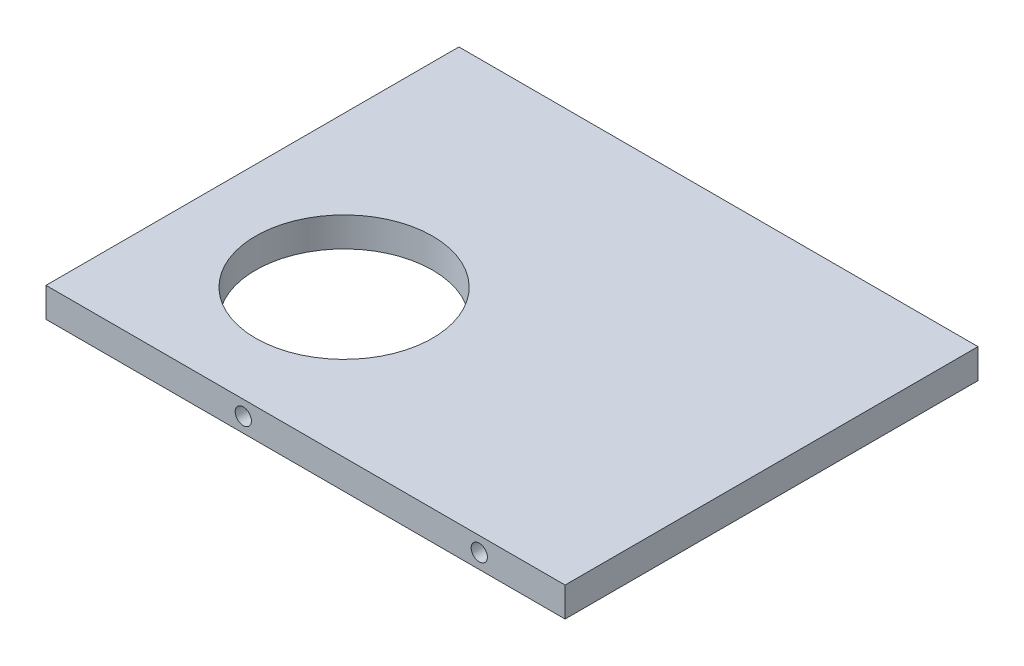
ISO-10303-21;
HEADER;
FILE_DESCRIPTION(('STEP AP214'),'2;1');
FILE_NAME('part.step','',(''),(''),'','','');
FILE_SCHEMA(('AUTOMOTIVE_DESIGN { 1 0 10303 214 1 1 1 1 }'));
ENDSEC;
DATA;
#1=APPLICATION_CONTEXT('core data for automotive mechanical design processes');
#2=APPLICATION_PROTOCOL_DEFINITION('international standard','automotive_design',2000,#1);
#3=PRODUCT_CONTEXT('',#1,'mechanical');
#4=PRODUCT('Part','Part','',(#3));
#5=PRODUCT_RELATED_PRODUCT_CATEGORY('part','',(#4));
#6=PRODUCT_DEFINITION_FORMATION('','',#4);
#7=PRODUCT_DEFINITION_CONTEXT('part definition',#1,'design');
#8=PRODUCT_DEFINITION('design','',#6,#7);
#9=PRODUCT_DEFINITION_SHAPE('','',#8);
#10=(LENGTH_UNIT() NAMED_UNIT(*) SI_UNIT(.MILLI.,.METRE.));
#11=(NAMED_UNIT(*) PLANE_ANGLE_UNIT() SI_UNIT($,.RADIAN.));
#12=(NAMED_UNIT(*) SI_UNIT($,.STERADIAN.) SOLID_ANGLE_UNIT());
#13=UNCERTAINTY_MEASURE_WITH_UNIT(LENGTH_MEASURE(1.E-05),#10,'distance_accuracy_value','');
#14=(GEOMETRIC_REPRESENTATION_CONTEXT(3) GLOBAL_UNCERTAINTY_ASSIGNED_CONTEXT((#13)) GLOBAL_UNIT_ASSIGNED_CONTEXT((#10,
#11,#12)) REPRESENTATION_CONTEXT('',''));
#15=CARTESIAN_POINT('',(0.,0.,0.));
#16=DIRECTION('',(0.,0.,1.));
#17=DIRECTION('',(1.,0.,0.));
#18=AXIS2_PLACEMENT_3D('',#15,#16,#17);
#19=CARTESIAN_POINT('',(44.,5.,-35.));
#20=DIRECTION('',(-1.,0.,0.));
#21=DIRECTION('',(0.,0.,1.));
#22=AXIS2_PLACEMENT_3D('',#19,#20,#21);
#23=PLANE('',#22);
#24=DIRECTION('',(0.,0.,-1.));
#25=VECTOR('',#24,1.);
#26=CARTESIAN_POINT('',(44.,0.,-35.));
#27=LINE('',#26,#25);
#28=CARTESIAN_POINT('',(44.,0.,35.));
#29=VERTEX_POINT('',#28);
#30=CARTESIAN_POINT('',(44.,0.,-35.));
#31=VERTEX_POINT('',#30);
#32=EDGE_CURVE('E113',#29,#31,#27,.T.);
#33=ORIENTED_EDGE('',*,*,#32,.T.);
#34=DIRECTION('',(0.,-1.,0.));
#35=VECTOR('',#34,1.);
#36=CARTESIAN_POINT('',(44.,5.,-35.));
#37=LINE('',#36,#35);
#38=CARTESIAN_POINT('',(44.,5.,-35.));
#39=VERTEX_POINT('',#38);
#40=EDGE_CURVE('E11',#39,#31,#37,.T.);
#41=ORIENTED_EDGE('',*,*,#40,.F.);
#42=DIRECTION('',(0.,0.,-1.));
#43=VECTOR('',#42,1.);
#44=CARTESIAN_POINT('',(44.,5.,-35.));
#45=LINE('',#44,#43);
#46=CARTESIAN_POINT('',(44.,5.,35.));
#47=VERTEX_POINT('',#46);
#48=EDGE_CURVE('E97',#47,#39,#45,.T.);
#49=ORIENTED_EDGE('',*,*,#48,.F.);
#50=DIRECTION('',(0.,-1.,0.));
#51=VECTOR('',#50,1.);
#52=CARTESIAN_POINT('',(44.,5.,35.));
#53=LINE('',#52,#51);
#54=EDGE_CURVE('E109',#47,#29,#53,.T.);
#55=ORIENTED_EDGE('',*,*,#54,.T.);
#56=EDGE_LOOP('',(#33,#41,#49,#55));
#57=FACE_BOUND('',#56,.T.);
#58=ADVANCED_FACE('F45',(#57),#23,.F.);
#59=CARTESIAN_POINT('',(-44.,5.,-35.));
#60=DIRECTION('',(0.,0.,1.));
#61=DIRECTION('',(1.,0.,0.));
#62=AXIS2_PLACEMENT_3D('',#59,#60,#61);
#63=PLANE('',#62);
#64=CARTESIAN_POINT('',(29.45,2.5,-35.));
#65=DIRECTION('',(0.,0.,-1.));
#66=DIRECTION('',(-1.,0.,0.));
#67=AXIS2_PLACEMENT_3D('',#64,#65,#66);
#68=CIRCLE('',#67,1.375);
#69=CARTESIAN_POINT('',(28.075,2.5,-35.));
#70=VERTEX_POINT('',#69);
#71=EDGE_CURVE('E159',#70,#70,#68,.T.);
#72=ORIENTED_EDGE('',*,*,#71,.F.);
#73=EDGE_LOOP('',(#72));
#74=FACE_BOUND('',#73,.T.);
#75=CARTESIAN_POINT('',(-10.55,2.5,-35.));
#76=DIRECTION('',(0.,0.,-1.));
#77=DIRECTION('',(-1.,0.,0.));
#78=AXIS2_PLACEMENT_3D('',#75,#76,#77);
#79=CIRCLE('',#78,1.375);
#80=CARTESIAN_POINT('',(-11.925,2.5,-35.));
#81=VERTEX_POINT('',#80);
#82=EDGE_CURVE('E154',#81,#81,#79,.T.);
#83=ORIENTED_EDGE('',*,*,#82,.F.);
#84=EDGE_LOOP('',(#83));
#85=FACE_BOUND('',#84,.T.);
#86=DIRECTION('',(-1.,0.,0.));
#87=VECTOR('',#86,1.);
#88=CARTESIAN_POINT('',(-44.,0.,-35.));
#89=LINE('',#88,#87);
#90=CARTESIAN_POINT('',(-44.,0.,-35.));
#91=VERTEX_POINT('',#90);
#92=EDGE_CURVE('E102',#31,#91,#89,.T.);
#93=ORIENTED_EDGE('',*,*,#92,.T.);
#94=DIRECTION('',(0.,-1.,0.));
#95=VECTOR('',#94,1.);
#96=CARTESIAN_POINT('',(-44.,5.,-35.));
#97=LINE('',#96,#95);
#98=CARTESIAN_POINT('',(-44.,5.,-35.));
#99=VERTEX_POINT('',#98);
#100=EDGE_CURVE('E54',#99,#91,#97,.T.);
#101=ORIENTED_EDGE('',*,*,#100,.F.);
#102=DIRECTION('',(-1.,0.,0.));
#103=VECTOR('',#102,1.);
#104=CARTESIAN_POINT('',(-44.,5.,-35.));
#105=LINE('',#104,#103);
#106=EDGE_CURVE('E92',#39,#99,#105,.T.);
#107=ORIENTED_EDGE('',*,*,#106,.F.);
#108=ORIENTED_EDGE('',*,*,#40,.T.);
#109=EDGE_LOOP('',(#93,#101,#107,#108));
#110=FACE_BOUND('',#109,.T.);
#111=ADVANCED_FACE('F101',(#74,#85,#110),#63,.F.);
#112=CARTESIAN_POINT('',(-44.,5.,-35.));
#113=DIRECTION('',(1.,0.,0.));
#114=DIRECTION('',(0.,0.,-1.));
#115=AXIS2_PLACEMENT_3D('',#112,#113,#114);
#116=PLANE('',#115);
#117=DIRECTION('',(0.,0.,1.));
#118=VECTOR('',#117,1.);
#119=CARTESIAN_POINT('',(-44.,0.,-35.));
#120=LINE('',#119,#118);
#121=CARTESIAN_POINT('',(-44.,0.,35.));
#122=VERTEX_POINT('',#121);
#123=EDGE_CURVE('E79',#91,#122,#120,.T.);
#124=ORIENTED_EDGE('',*,*,#123,.T.);
#125=DIRECTION('',(0.,-1.,0.));
#126=VECTOR('',#125,1.);
#127=CARTESIAN_POINT('',(-44.,5.,35.));
#128=LINE('',#127,#126);
#129=CARTESIAN_POINT('',(-44.,5.,35.));
#130=VERTEX_POINT('',#129);
#131=EDGE_CURVE('E104',#130,#122,#128,.T.);
#132=ORIENTED_EDGE('',*,*,#131,.F.);
#133=DIRECTION('',(0.,0.,1.));
#134=VECTOR('',#133,1.);
#135=CARTESIAN_POINT('',(-44.,5.,-35.));
#136=LINE('',#135,#134);
#137=EDGE_CURVE('E95',#99,#130,#136,.T.);
#138=ORIENTED_EDGE('',*,*,#137,.F.);
#139=ORIENTED_EDGE('',*,*,#100,.T.);
#140=EDGE_LOOP('',(#124,#132,#138,#139));
#141=FACE_BOUND('',#140,.T.);
#142=ADVANCED_FACE('F105',(#141),#116,.F.);
#143=CARTESIAN_POINT('',(-44.,5.,35.));
#144=DIRECTION('',(0.,0.,-1.));
#145=DIRECTION('',(-1.,0.,0.));
#146=AXIS2_PLACEMENT_3D('',#143,#144,#145);
#147=PLANE('',#146);
#148=CARTESIAN_POINT('',(-10.55,2.5,35.));
#149=DIRECTION('',(0.,0.,1.));
#150=DIRECTION('',(1.,0.,0.));
#151=AXIS2_PLACEMENT_3D('',#148,#149,#150);
#152=CIRCLE('',#151,1.375);
#153=CARTESIAN_POINT('',(-9.17499999999997,2.5,35.));
#154=VERTEX_POINT('',#153);
#155=EDGE_CURVE('E143',#154,#154,#152,.T.);
#156=ORIENTED_EDGE('',*,*,#155,.F.);
#157=EDGE_LOOP('',(#156));
#158=FACE_BOUND('',#157,.T.);
#159=CARTESIAN_POINT('',(29.45,2.5,35.));
#160=DIRECTION('',(0.,0.,1.));
#161=DIRECTION('',(1.,0.,0.));
#162=AXIS2_PLACEMENT_3D('',#159,#160,#161);
#163=CIRCLE('',#162,1.375);
#164=CARTESIAN_POINT('',(30.825,2.5,35.));
#165=VERTEX_POINT('',#164);
#166=EDGE_CURVE('E138',#165,#165,#163,.T.);
#167=ORIENTED_EDGE('',*,*,#166,.F.);
#168=EDGE_LOOP('',(#167));
#169=FACE_BOUND('',#168,.T.);
#170=DIRECTION('',(1.,0.,0.));
#171=VECTOR('',#170,1.);
#172=CARTESIAN_POINT('',(-44.,0.,35.));
#173=LINE('',#172,#171);
#174=EDGE_CURVE('E85',#122,#29,#173,.T.);
#175=ORIENTED_EDGE('',*,*,#174,.T.);
#176=ORIENTED_EDGE('',*,*,#54,.F.);
#177=DIRECTION('',(1.,0.,0.));
#178=VECTOR('',#177,1.);
#179=CARTESIAN_POINT('',(-44.,5.,35.));
#180=LINE('',#179,#178);
#181=EDGE_CURVE('E62',#130,#47,#180,.T.);
#182=ORIENTED_EDGE('',*,*,#181,.F.);
#183=ORIENTED_EDGE('',*,*,#131,.T.);
#184=EDGE_LOOP('',(#175,#176,#182,#183));
#185=FACE_BOUND('',#184,.T.);
#186=ADVANCED_FACE('F127',(#158,#169,#185),#147,.F.);
#187=CARTESIAN_POINT('',(0.,5.,0.));
#188=DIRECTION('',(0.,1.,0.));
#189=DIRECTION('',(0.,0.,1.));
#190=AXIS2_PLACEMENT_3D('',#187,#188,#189);
#191=PLANE('',#190);
#192=CARTESIAN_POINT('',(-18.4696577969967,5.,10.));
#193=DIRECTION('',(0.,1.,0.));
#194=DIRECTION('',(0.,0.,1.));
#195=AXIS2_PLACEMENT_3D('',#192,#193,#194);
#196=CIRCLE('',#195,15.);
#197=CARTESIAN_POINT('',(-18.4696577969967,5.,25.));
#198=VERTEX_POINT('',#197);
#199=EDGE_CURVE('E166',#198,#198,#196,.T.);
#200=ORIENTED_EDGE('',*,*,#199,.F.);
#201=EDGE_LOOP('',(#200));
#202=FACE_BOUND('',#201,.T.);
#203=ORIENTED_EDGE('',*,*,#48,.T.);
#204=ORIENTED_EDGE('',*,*,#106,.T.);
#205=ORIENTED_EDGE('',*,*,#137,.T.);
#206=ORIENTED_EDGE('',*,*,#181,.T.);
#207=EDGE_LOOP('',(#203,#204,#205,#206));
#208=FACE_BOUND('',#207,.T.);
#209=ADVANCED_FACE('F93',(#202,#208),#191,.T.);
#210=CARTESIAN_POINT('',(0.,0.,0.));
#211=DIRECTION('',(0.,1.,0.));
#212=DIRECTION('',(0.,0.,1.));
#213=AXIS2_PLACEMENT_3D('',#210,#211,#212);
#214=PLANE('',#213);
#215=CARTESIAN_POINT('',(-18.4696577969967,0.,10.));
#216=DIRECTION('',(0.,1.,0.));
#217=DIRECTION('',(0.,0.,1.));
#218=AXIS2_PLACEMENT_3D('',#215,#216,#217);
#219=CIRCLE('',#218,15.);
#220=CARTESIAN_POINT('',(-18.4696577969967,0.,25.));
#221=VERTEX_POINT('',#220);
#222=EDGE_CURVE('E155',#221,#221,#219,.T.);
#223=ORIENTED_EDGE('',*,*,#222,.T.);
#224=EDGE_LOOP('',(#223));
#225=FACE_BOUND('',#224,.T.);
#226=ORIENTED_EDGE('',*,*,#32,.F.);
#227=ORIENTED_EDGE('',*,*,#174,.F.);
#228=ORIENTED_EDGE('',*,*,#123,.F.);
#229=ORIENTED_EDGE('',*,*,#92,.F.);
#230=EDGE_LOOP('',(#226,#227,#228,#229));
#231=FACE_BOUND('',#230,.T.);
#232=ADVANCED_FACE('F130',(#225,#231),#214,.F.);
#233=CARTESIAN_POINT('',(29.45,2.5,30.));
#234=DIRECTION('',(0.,0.,1.));
#235=DIRECTION('',(1.,0.,0.));
#236=AXIS2_PLACEMENT_3D('',#233,#234,#235);
#237=CYLINDRICAL_SURFACE('',#236,1.375);
#238=CARTESIAN_POINT('',(29.45,2.5,30.));
#239=DIRECTION('',(0.,0.,1.));
#240=DIRECTION('',(1.,0.,0.));
#241=AXIS2_PLACEMENT_3D('',#238,#239,#240);
#242=CIRCLE('',#241,1.375);
#243=CARTESIAN_POINT('',(30.825,2.5,30.));
#244=VERTEX_POINT('',#243);
#245=EDGE_CURVE('E134',#244,#244,#242,.T.);
#246=ORIENTED_EDGE('',*,*,#245,.F.);
#247=EDGE_LOOP('',(#246));
#248=FACE_BOUND('',#247,.T.);
#249=ORIENTED_EDGE('',*,*,#166,.T.);
#250=EDGE_LOOP('',(#249));
#251=FACE_BOUND('',#250,.T.);
#252=ADVANCED_FACE('F188',(#248,#251),#237,.F.);
#253=CARTESIAN_POINT('',(29.45,2.5,30.));
#254=DIRECTION('',(0.,0.,1.));
#255=DIRECTION('',(1.,0.,0.));
#256=AXIS2_PLACEMENT_3D('',#253,#254,#255);
#257=PLANE('',#256);
#258=ORIENTED_EDGE('',*,*,#245,.T.);
#259=EDGE_LOOP('',(#258));
#260=FACE_BOUND('',#259,.T.);
#261=ADVANCED_FACE('F228',(#260),#257,.T.);
#262=CARTESIAN_POINT('',(-10.55,2.5,30.));
#263=DIRECTION('',(0.,0.,1.));
#264=DIRECTION('',(1.,0.,0.));
#265=AXIS2_PLACEMENT_3D('',#262,#263,#264);
#266=CYLINDRICAL_SURFACE('',#265,1.375);
#267=CARTESIAN_POINT('',(-10.55,2.5,30.));
#268=DIRECTION('',(0.,0.,1.));
#269=DIRECTION('',(1.,0.,0.));
#270=AXIS2_PLACEMENT_3D('',#267,#268,#269);
#271=CIRCLE('',#270,1.375);
#272=CARTESIAN_POINT('',(-9.17499999999997,2.5,30.));
#273=VERTEX_POINT('',#272);
#274=EDGE_CURVE('E117',#273,#273,#271,.T.);
#275=ORIENTED_EDGE('',*,*,#274,.F.);
#276=EDGE_LOOP('',(#275));
#277=FACE_BOUND('',#276,.T.);
#278=ORIENTED_EDGE('',*,*,#155,.T.);
#279=EDGE_LOOP('',(#278));
#280=FACE_BOUND('',#279,.T.);
#281=ADVANCED_FACE('F219',(#277,#280),#266,.F.);
#282=CARTESIAN_POINT('',(-10.55,2.5,30.));
#283=DIRECTION('',(0.,0.,1.));
#284=DIRECTION('',(1.,0.,0.));
#285=AXIS2_PLACEMENT_3D('',#282,#283,#284);
#286=PLANE('',#285);
#287=ORIENTED_EDGE('',*,*,#274,.T.);
#288=EDGE_LOOP('',(#287));
#289=FACE_BOUND('',#288,.T.);
#290=ADVANCED_FACE('F209',(#289),#286,.T.);
#291=CARTESIAN_POINT('',(-10.55,2.5,-30.));
#292=DIRECTION('',(0.,0.,-1.));
#293=DIRECTION('',(-1.,0.,0.));
#294=AXIS2_PLACEMENT_3D('',#291,#292,#293);
#295=CYLINDRICAL_SURFACE('',#294,1.375);
#296=CARTESIAN_POINT('',(-10.55,2.5,-30.));
#297=DIRECTION('',(0.,0.,-1.));
#298=DIRECTION('',(-1.,0.,0.));
#299=AXIS2_PLACEMENT_3D('',#296,#297,#298);
#300=CIRCLE('',#299,1.375);
#301=CARTESIAN_POINT('',(-11.925,2.5,-30.));
#302=VERTEX_POINT('',#301);
#303=EDGE_CURVE('E150',#302,#302,#300,.T.);
#304=ORIENTED_EDGE('',*,*,#303,.F.);
#305=EDGE_LOOP('',(#304));
#306=FACE_BOUND('',#305,.T.);
#307=ORIENTED_EDGE('',*,*,#82,.T.);
#308=EDGE_LOOP('',(#307));
#309=FACE_BOUND('',#308,.T.);
#310=ADVANCED_FACE('F206',(#306,#309),#295,.F.);
#311=CARTESIAN_POINT('',(-10.55,2.5,-30.));
#312=DIRECTION('',(0.,0.,-1.));
#313=DIRECTION('',(-1.,0.,0.));
#314=AXIS2_PLACEMENT_3D('',#311,#312,#313);
#315=PLANE('',#314);
#316=ORIENTED_EDGE('',*,*,#303,.T.);
#317=EDGE_LOOP('',(#316));
#318=FACE_BOUND('',#317,.T.);
#319=ADVANCED_FACE('F208',(#318),#315,.T.);
#320=CARTESIAN_POINT('',(29.45,2.5,-30.));
#321=DIRECTION('',(0.,0.,-1.));
#322=DIRECTION('',(-1.,0.,0.));
#323=AXIS2_PLACEMENT_3D('',#320,#321,#322);
#324=CYLINDRICAL_SURFACE('',#323,1.375);
#325=CARTESIAN_POINT('',(29.45,2.5,-30.));
#326=DIRECTION('',(0.,0.,-1.));
#327=DIRECTION('',(-1.,0.,0.));
#328=AXIS2_PLACEMENT_3D('',#325,#326,#327);
#329=CIRCLE('',#328,1.375);
#330=CARTESIAN_POINT('',(28.075,2.5,-30.));
#331=VERTEX_POINT('',#330);
#332=EDGE_CURVE('E139',#331,#331,#329,.T.);
#333=ORIENTED_EDGE('',*,*,#332,.F.);
#334=EDGE_LOOP('',(#333));
#335=FACE_BOUND('',#334,.T.);
#336=ORIENTED_EDGE('',*,*,#71,.T.);
#337=EDGE_LOOP('',(#336));
#338=FACE_BOUND('',#337,.T.);
#339=ADVANCED_FACE('F216',(#335,#338),#324,.F.);
#340=CARTESIAN_POINT('',(29.45,2.5,-30.));
#341=DIRECTION('',(0.,0.,-1.));
#342=DIRECTION('',(-1.,0.,0.));
#343=AXIS2_PLACEMENT_3D('',#340,#341,#342);
#344=PLANE('',#343);
#345=ORIENTED_EDGE('',*,*,#332,.T.);
#346=EDGE_LOOP('',(#345));
#347=FACE_BOUND('',#346,.T.);
#348=ADVANCED_FACE('F178',(#347),#344,.T.);
#349=CARTESIAN_POINT('',(-18.4696577969967,0.,10.));
#350=DIRECTION('',(0.,1.,0.));
#351=DIRECTION('',(0.,0.,1.));
#352=AXIS2_PLACEMENT_3D('',#349,#350,#351);
#353=CYLINDRICAL_SURFACE('',#352,15.);
#354=ORIENTED_EDGE('',*,*,#222,.F.);
#355=EDGE_LOOP('',(#354));
#356=FACE_BOUND('',#355,.T.);
#357=ORIENTED_EDGE('',*,*,#199,.T.);
#358=EDGE_LOOP('',(#357));
#359=FACE_BOUND('',#358,.T.);
#360=ADVANCED_FACE('F175',(#356,#359),#353,.F.);
#361=CLOSED_SHELL('',(#58,#111,#142,#186,#209,#232,#252,#261,#281,#290,#310,#319,#339,#348,#360));
#362=MANIFOLD_SOLID_BREP('B2',#361);
#363=ADVANCED_BREP_SHAPE_REPRESENTATION('',(#18,#362),#14);
#364=SHAPE_DEFINITION_REPRESENTATION(#9,#363);
ENDSEC;
END-ISO-10303-21;
